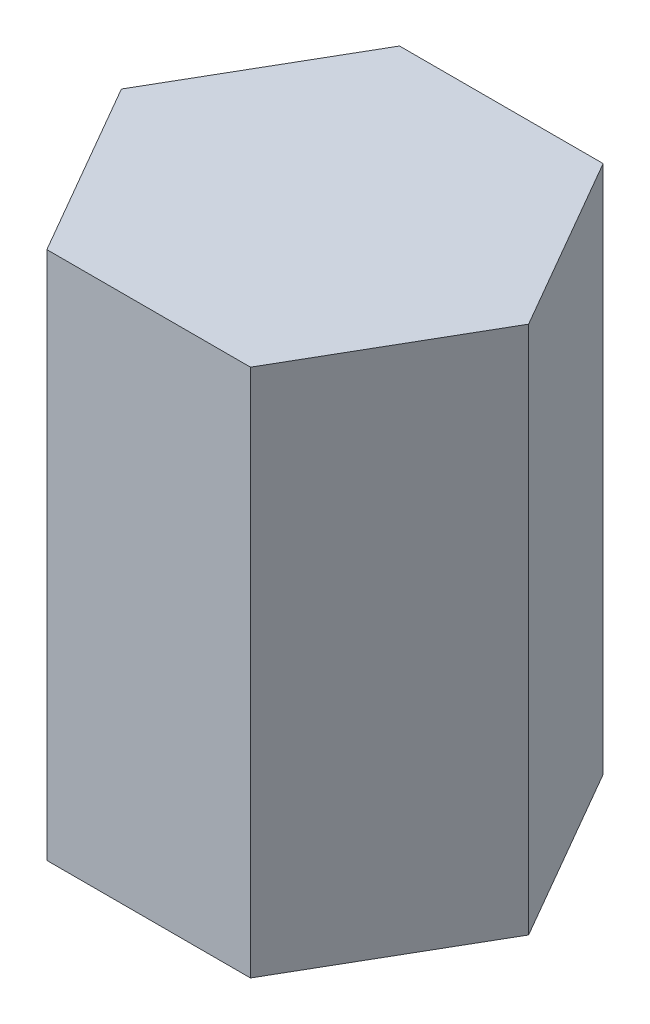
ISO-10303-21;
HEADER;
FILE_DESCRIPTION(('STEP AP214'),'2;1');
FILE_NAME('part.step','',(''),(''),'','','');
FILE_SCHEMA(('AUTOMOTIVE_DESIGN { 1 0 10303 214 1 1 1 1 }'));
ENDSEC;
DATA;
#1=APPLICATION_CONTEXT('core data for automotive mechanical design processes');
#2=APPLICATION_PROTOCOL_DEFINITION('international standard','automotive_design',2000,#1);
#3=PRODUCT_CONTEXT('',#1,'mechanical');
#4=PRODUCT('Part','Part','',(#3));
#5=PRODUCT_RELATED_PRODUCT_CATEGORY('part','',(#4));
#6=PRODUCT_DEFINITION_FORMATION('','',#4);
#7=PRODUCT_DEFINITION_CONTEXT('part definition',#1,'design');
#8=PRODUCT_DEFINITION('design','',#6,#7);
#9=PRODUCT_DEFINITION_SHAPE('','',#8);
#10=(LENGTH_UNIT() NAMED_UNIT(*) SI_UNIT(.MILLI.,.METRE.));
#11=(NAMED_UNIT(*) PLANE_ANGLE_UNIT() SI_UNIT($,.RADIAN.));
#12=(NAMED_UNIT(*) SI_UNIT($,.STERADIAN.) SOLID_ANGLE_UNIT());
#13=UNCERTAINTY_MEASURE_WITH_UNIT(LENGTH_MEASURE(1.E-05),#10,'distance_accuracy_value','');
#14=(GEOMETRIC_REPRESENTATION_CONTEXT(3) GLOBAL_UNCERTAINTY_ASSIGNED_CONTEXT((#13)) GLOBAL_UNIT_ASSIGNED_CONTEXT((#10,
#11,#12)) REPRESENTATION_CONTEXT('',''));
#15=CARTESIAN_POINT('',(0.,0.,0.));
#16=DIRECTION('',(0.,0.,1.));
#17=DIRECTION('',(1.,0.,0.));
#18=AXIS2_PLACEMENT_3D('',#15,#16,#17);
#19=CARTESIAN_POINT('',(28.8675134594819,75.,49.9999999999998));
#20=DIRECTION('',(-0.866025403784441,0.,-0.499999999999995));
#21=DIRECTION('',(-0.499999999999995,0.,0.866025403784441));
#22=AXIS2_PLACEMENT_3D('',#19,#20,#21);
#23=PLANE('',#22);
#24=DIRECTION('',(0.499999999999995,0.,-0.866025403784441));
#25=VECTOR('',#24,1.);
#26=CARTESIAN_POINT('',(28.8675134594819,-75.,49.9999999999998));
#27=LINE('',#26,#25);
#28=CARTESIAN_POINT('',(28.8675134594819,-75.,49.9999999999998));
#29=VERTEX_POINT('',#28);
#30=CARTESIAN_POINT('',(57.7350269189627,-75.,0.));
#31=VERTEX_POINT('',#30);
#32=EDGE_CURVE('E132',#29,#31,#27,.T.);
#33=ORIENTED_EDGE('',*,*,#32,.T.);
#34=DIRECTION('',(0.,-1.,0.));
#35=VECTOR('',#34,1.);
#36=CARTESIAN_POINT('',(57.7350269189627,75.,0.));
#37=LINE('',#36,#35);
#38=CARTESIAN_POINT('',(57.7350269189627,75.,0.));
#39=VERTEX_POINT('',#38);
#40=EDGE_CURVE('E11',#39,#31,#37,.T.);
#41=ORIENTED_EDGE('',*,*,#40,.F.);
#42=DIRECTION('',(0.499999999999995,0.,-0.866025403784441));
#43=VECTOR('',#42,1.);
#44=CARTESIAN_POINT('',(28.8675134594819,75.,49.9999999999998));
#45=LINE('',#44,#43);
#46=CARTESIAN_POINT('',(28.8675134594819,75.,49.9999999999998));
#47=VERTEX_POINT('',#46);
#48=EDGE_CURVE('E148',#47,#39,#45,.T.);
#49=ORIENTED_EDGE('',*,*,#48,.F.);
#50=DIRECTION('',(0.,-1.,0.));
#51=VECTOR('',#50,1.);
#52=CARTESIAN_POINT('',(28.8675134594819,75.,49.9999999999998));
#53=LINE('',#52,#51);
#54=EDGE_CURVE('E128',#47,#29,#53,.T.);
#55=ORIENTED_EDGE('',*,*,#54,.T.);
#56=EDGE_LOOP('',(#33,#41,#49,#55));
#57=FACE_BOUND('',#56,.T.);
#58=ADVANCED_FACE('F43',(#57),#23,.F.);
#59=CARTESIAN_POINT('',(57.7350269189627,75.,0.));
#60=DIRECTION('',(-0.866025403784438,0.,0.500000000000001));
#61=DIRECTION('',(0.500000000000001,0.,0.866025403784438));
#62=AXIS2_PLACEMENT_3D('',#59,#60,#61);
#63=PLANE('',#62);
#64=DIRECTION('',(-0.500000000000001,0.,-0.866025403784438));
#65=VECTOR('',#64,1.);
#66=CARTESIAN_POINT('',(57.7350269189627,-75.,0.));
#67=LINE('',#66,#65);
#68=CARTESIAN_POINT('',(28.8675134594812,-75.,-50.0000000000002));
#69=VERTEX_POINT('',#68);
#70=EDGE_CURVE('E136',#31,#69,#67,.T.);
#71=ORIENTED_EDGE('',*,*,#70,.T.);
#72=DIRECTION('',(0.,-1.,0.));
#73=VECTOR('',#72,1.);
#74=CARTESIAN_POINT('',(28.8675134594812,75.,-50.0000000000002));
#75=LINE('',#74,#73);
#76=CARTESIAN_POINT('',(28.8675134594812,75.,-50.0000000000002));
#77=VERTEX_POINT('',#76);
#78=EDGE_CURVE('E52',#77,#69,#75,.T.);
#79=ORIENTED_EDGE('',*,*,#78,.F.);
#80=DIRECTION('',(-0.500000000000001,0.,-0.866025403784438));
#81=VECTOR('',#80,1.);
#82=CARTESIAN_POINT('',(57.7350269189627,75.,0.));
#83=LINE('',#82,#81);
#84=EDGE_CURVE('E97',#39,#77,#83,.T.);
#85=ORIENTED_EDGE('',*,*,#84,.F.);
#86=ORIENTED_EDGE('',*,*,#40,.T.);
#87=EDGE_LOOP('',(#71,#79,#85,#86));
#88=FACE_BOUND('',#87,.T.);
#89=ADVANCED_FACE('F176',(#88),#63,.F.);
#90=CARTESIAN_POINT('',(28.8675134594812,75.,-50.0000000000002));
#91=DIRECTION('',(0.,0.,1.));
#92=DIRECTION('',(1.,0.,0.));
#93=AXIS2_PLACEMENT_3D('',#90,#91,#92);
#94=PLANE('',#93);
#95=DIRECTION('',(-1.,0.,0.));
#96=VECTOR('',#95,1.);
#97=CARTESIAN_POINT('',(28.8675134594812,-75.,-50.0000000000002));
#98=LINE('',#97,#96);
#99=CARTESIAN_POINT('',(-28.8675134594816,-75.,-50.));
#100=VERTEX_POINT('',#99);
#101=EDGE_CURVE('E139',#69,#100,#98,.T.);
#102=ORIENTED_EDGE('',*,*,#101,.T.);
#103=DIRECTION('',(0.,-1.,0.));
#104=VECTOR('',#103,1.);
#105=CARTESIAN_POINT('',(-28.8675134594816,75.,-50.));
#106=LINE('',#105,#104);
#107=CARTESIAN_POINT('',(-28.8675134594816,75.,-50.));
#108=VERTEX_POINT('',#107);
#109=EDGE_CURVE('E121',#108,#100,#106,.T.);
#110=ORIENTED_EDGE('',*,*,#109,.F.);
#111=DIRECTION('',(-1.,0.,0.));
#112=VECTOR('',#111,1.);
#113=CARTESIAN_POINT('',(28.8675134594812,75.,-50.0000000000002));
#114=LINE('',#113,#112);
#115=EDGE_CURVE('E110',#77,#108,#114,.T.);
#116=ORIENTED_EDGE('',*,*,#115,.F.);
#117=ORIENTED_EDGE('',*,*,#78,.T.);
#118=EDGE_LOOP('',(#102,#110,#116,#117));
#119=FACE_BOUND('',#118,.T.);
#120=ADVANCED_FACE('F158',(#119),#94,.F.);
#121=CARTESIAN_POINT('',(-28.8675134594816,75.,-50.));
#122=DIRECTION('',(0.866025403784441,0.,0.499999999999995));
#123=DIRECTION('',(0.499999999999995,0.,-0.866025403784441));
#124=AXIS2_PLACEMENT_3D('',#121,#122,#123);
#125=PLANE('',#124);
#126=DIRECTION('',(-0.499999999999995,0.,0.866025403784442));
#127=VECTOR('',#126,1.);
#128=CARTESIAN_POINT('',(-28.8675134594816,-75.,-50.));
#129=LINE('',#128,#127);
#130=CARTESIAN_POINT('',(-57.7350269189627,-75.,4.03161538170329E-13));
#131=VERTEX_POINT('',#130);
#132=EDGE_CURVE('E119',#100,#131,#129,.T.);
#133=ORIENTED_EDGE('',*,*,#132,.T.);
#134=DIRECTION('',(0.,-1.,0.));
#135=VECTOR('',#134,1.);
#136=CARTESIAN_POINT('',(-57.7350269189627,75.,4.03161538170329E-13));
#137=LINE('',#136,#135);
#138=CARTESIAN_POINT('',(-57.7350269189627,75.,4.03161538170329E-13));
#139=VERTEX_POINT('',#138);
#140=EDGE_CURVE('E116',#139,#131,#137,.T.);
#141=ORIENTED_EDGE('',*,*,#140,.F.);
#142=DIRECTION('',(-0.499999999999995,0.,0.866025403784442));
#143=VECTOR('',#142,1.);
#144=CARTESIAN_POINT('',(-28.8675134594816,75.,-50.));
#145=LINE('',#144,#143);
#146=EDGE_CURVE('E104',#108,#139,#145,.T.);
#147=ORIENTED_EDGE('',*,*,#146,.F.);
#148=ORIENTED_EDGE('',*,*,#109,.T.);
#149=EDGE_LOOP('',(#133,#141,#147,#148));
#150=FACE_BOUND('',#149,.T.);
#151=ADVANCED_FACE('F117',(#150),#125,.F.);
#152=CARTESIAN_POINT('',(-57.7350269189627,75.,4.03161538170329E-13));
#153=DIRECTION('',(0.866025403784434,0.,-0.500000000000007));
#154=DIRECTION('',(-0.500000000000007,0.,-0.866025403784435));
#155=AXIS2_PLACEMENT_3D('',#152,#153,#154);
#156=PLANE('',#155);
#157=DIRECTION('',(0.500000000000007,0.,0.866025403784434));
#158=VECTOR('',#157,1.);
#159=CARTESIAN_POINT('',(-57.7350269189627,-75.,4.03161538170329E-13));
#160=LINE('',#159,#158);
#161=CARTESIAN_POINT('',(-28.8675134594809,-75.,50.0000000000004));
#162=VERTEX_POINT('',#161);
#163=EDGE_CURVE('E83',#131,#162,#160,.T.);
#164=ORIENTED_EDGE('',*,*,#163,.T.);
#165=DIRECTION('',(0.,-1.,0.));
#166=VECTOR('',#165,1.);
#167=CARTESIAN_POINT('',(-28.8675134594809,75.,50.0000000000004));
#168=LINE('',#167,#166);
#169=CARTESIAN_POINT('',(-28.8675134594809,75.,50.0000000000004));
#170=VERTEX_POINT('',#169);
#171=EDGE_CURVE('E122',#170,#162,#168,.T.);
#172=ORIENTED_EDGE('',*,*,#171,.F.);
#173=DIRECTION('',(0.500000000000007,0.,0.866025403784434));
#174=VECTOR('',#173,1.);
#175=CARTESIAN_POINT('',(-57.7350269189627,75.,4.03161538170329E-13));
#176=LINE('',#175,#174);
#177=EDGE_CURVE('E108',#139,#170,#176,.T.);
#178=ORIENTED_EDGE('',*,*,#177,.F.);
#179=ORIENTED_EDGE('',*,*,#140,.T.);
#180=EDGE_LOOP('',(#164,#172,#178,#179));
#181=FACE_BOUND('',#180,.T.);
#182=ADVANCED_FACE('F124',(#181),#156,.F.);
#183=CARTESIAN_POINT('',(-28.8675134594809,75.,50.0000000000004));
#184=DIRECTION('',(0.,0.,-1.));
#185=DIRECTION('',(-1.,0.,0.));
#186=AXIS2_PLACEMENT_3D('',#183,#184,#185);
#187=PLANE('',#186);
#188=DIRECTION('',(1.,0.,0.));
#189=VECTOR('',#188,1.);
#190=CARTESIAN_POINT('',(-28.8675134594809,-75.,50.0000000000004));
#191=LINE('',#190,#189);
#192=EDGE_CURVE('E89',#162,#29,#191,.T.);
#193=ORIENTED_EDGE('',*,*,#192,.T.);
#194=ORIENTED_EDGE('',*,*,#54,.F.);
#195=DIRECTION('',(1.,0.,0.));
#196=VECTOR('',#195,1.);
#197=CARTESIAN_POINT('',(-28.8675134594809,75.,50.0000000000004));
#198=LINE('',#197,#196);
#199=EDGE_CURVE('E60',#170,#47,#198,.T.);
#200=ORIENTED_EDGE('',*,*,#199,.F.);
#201=ORIENTED_EDGE('',*,*,#171,.T.);
#202=EDGE_LOOP('',(#193,#194,#200,#201));
#203=FACE_BOUND('',#202,.T.);
#204=ADVANCED_FACE('F165',(#203),#187,.F.);
#205=CARTESIAN_POINT('',(0.,75.,0.));
#206=DIRECTION('',(0.,1.,0.));
#207=DIRECTION('',(0.,0.,1.));
#208=AXIS2_PLACEMENT_3D('',#205,#206,#207);
#209=PLANE('',#208);
#210=ORIENTED_EDGE('',*,*,#48,.T.);
#211=ORIENTED_EDGE('',*,*,#84,.T.);
#212=ORIENTED_EDGE('',*,*,#115,.T.);
#213=ORIENTED_EDGE('',*,*,#146,.T.);
#214=ORIENTED_EDGE('',*,*,#177,.T.);
#215=ORIENTED_EDGE('',*,*,#199,.T.);
#216=EDGE_LOOP('',(#210,#211,#212,#213,#214,#215));
#217=FACE_BOUND('',#216,.T.);
#218=ADVANCED_FACE('F106',(#217),#209,.T.);
#219=CARTESIAN_POINT('',(0.,-75.,0.));
#220=DIRECTION('',(0.,1.,0.));
#221=DIRECTION('',(0.,0.,1.));
#222=AXIS2_PLACEMENT_3D('',#219,#220,#221);
#223=PLANE('',#222);
#224=ORIENTED_EDGE('',*,*,#32,.F.);
#225=ORIENTED_EDGE('',*,*,#192,.F.);
#226=ORIENTED_EDGE('',*,*,#163,.F.);
#227=ORIENTED_EDGE('',*,*,#132,.F.);
#228=ORIENTED_EDGE('',*,*,#101,.F.);
#229=ORIENTED_EDGE('',*,*,#70,.F.);
#230=EDGE_LOOP('',(#224,#225,#226,#227,#228,#229));
#231=FACE_BOUND('',#230,.T.);
#232=ADVANCED_FACE('F161',(#231),#223,.F.);
#233=CLOSED_SHELL('',(#58,#89,#120,#151,#182,#204,#218,#232));
#234=MANIFOLD_SOLID_BREP('B2',#233);
#235=ADVANCED_BREP_SHAPE_REPRESENTATION('',(#18,#234),#14);
#236=SHAPE_DEFINITION_REPRESENTATION(#9,#235);
ENDSEC;
END-ISO-10303-21;
